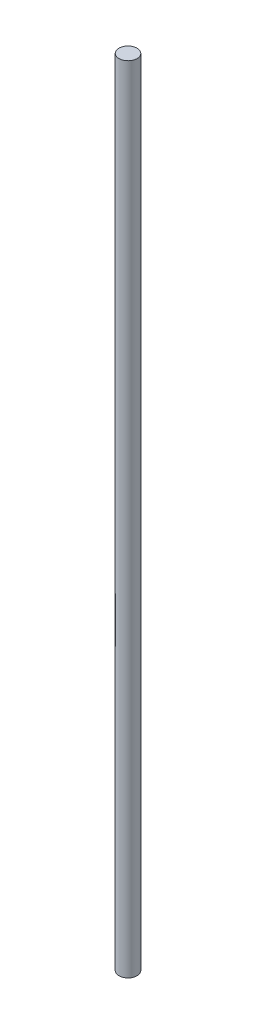
ISO-10303-21;
HEADER;
FILE_DESCRIPTION(('STEP AP214'),'2;1');
FILE_NAME('part.step','',(''),(''),'','','');
FILE_SCHEMA(('AUTOMOTIVE_DESIGN { 1 0 10303 214 1 1 1 1 }'));
ENDSEC;
DATA;
#1=APPLICATION_CONTEXT('core data for automotive mechanical design processes');
#2=APPLICATION_PROTOCOL_DEFINITION('international standard','automotive_design',2000,#1);
#3=PRODUCT_CONTEXT('',#1,'mechanical');
#4=PRODUCT('Part','Part','',(#3));
#5=PRODUCT_RELATED_PRODUCT_CATEGORY('part','',(#4));
#6=PRODUCT_DEFINITION_FORMATION('','',#4);
#7=PRODUCT_DEFINITION_CONTEXT('part definition',#1,'design');
#8=PRODUCT_DEFINITION('design','',#6,#7);
#9=PRODUCT_DEFINITION_SHAPE('','',#8);
#10=(LENGTH_UNIT() NAMED_UNIT(*) SI_UNIT(.MILLI.,.METRE.));
#11=(NAMED_UNIT(*) PLANE_ANGLE_UNIT() SI_UNIT($,.RADIAN.));
#12=(NAMED_UNIT(*) SI_UNIT($,.STERADIAN.) SOLID_ANGLE_UNIT());
#13=UNCERTAINTY_MEASURE_WITH_UNIT(LENGTH_MEASURE(1.E-05),#10,'distance_accuracy_value','');
#14=(GEOMETRIC_REPRESENTATION_CONTEXT(3) GLOBAL_UNCERTAINTY_ASSIGNED_CONTEXT((#13)) GLOBAL_UNIT_ASSIGNED_CONTEXT((#10,
#11,#12)) REPRESENTATION_CONTEXT('',''));
#15=CARTESIAN_POINT('',(0.,0.,0.));
#16=DIRECTION('',(0.,0.,1.));
#17=DIRECTION('',(1.,0.,0.));
#18=AXIS2_PLACEMENT_3D('',#15,#16,#17);
#19=CARTESIAN_POINT('',(0.,439.4,0.));
#20=DIRECTION('',(0.,1.,0.));
#21=DIRECTION('',(0.,0.,1.));
#22=AXIS2_PLACEMENT_3D('',#19,#20,#21);
#23=PLANE('',#22);
#24=CARTESIAN_POINT('',(0.,439.4,0.));
#25=DIRECTION('',(0.,-1.,0.));
#26=DIRECTION('',(0.,0.,-1.));
#27=AXIS2_PLACEMENT_3D('',#24,#25,#26);
#28=CIRCLE('',#27,5.);
#29=CARTESIAN_POINT('',(0.,439.4,-5.));
#30=VERTEX_POINT('',#29);
#31=EDGE_CURVE('E10',#30,#30,#28,.T.);
#32=ORIENTED_EDGE('',*,*,#31,.F.);
#33=EDGE_LOOP('',(#32));
#34=FACE_BOUND('',#33,.T.);
#35=ADVANCED_FACE('F31',(#34),#23,.T.);
#36=CARTESIAN_POINT('',(0.,0.,0.));
#37=DIRECTION('',(0.,-1.,0.));
#38=DIRECTION('',(0.,0.,-1.));
#39=AXIS2_PLACEMENT_3D('',#36,#37,#38);
#40=CYLINDRICAL_SURFACE('',#39,5.);
#41=ORIENTED_EDGE('',*,*,#31,.T.);
#42=EDGE_LOOP('',(#41));
#43=FACE_BOUND('',#42,.T.);
#44=CARTESIAN_POINT('',(0.,0.,0.));
#45=DIRECTION('',(0.,-1.,0.));
#46=DIRECTION('',(0.,0.,-1.));
#47=AXIS2_PLACEMENT_3D('',#44,#45,#46);
#48=CIRCLE('',#47,5.);
#49=CARTESIAN_POINT('',(0.,0.,-5.));
#50=VERTEX_POINT('',#49);
#51=EDGE_CURVE('E37',#50,#50,#48,.T.);
#52=ORIENTED_EDGE('',*,*,#51,.F.);
#53=EDGE_LOOP('',(#52));
#54=FACE_BOUND('',#53,.T.);
#55=ADVANCED_FACE('F45',(#43,#54),#40,.T.);
#56=CARTESIAN_POINT('',(0.,0.,0.));
#57=DIRECTION('',(0.,-1.,0.));
#58=DIRECTION('',(0.,0.,-1.));
#59=AXIS2_PLACEMENT_3D('',#56,#57,#58);
#60=PLANE('',#59);
#61=ORIENTED_EDGE('',*,*,#51,.T.);
#62=EDGE_LOOP('',(#61));
#63=FACE_BOUND('',#62,.T.);
#64=ADVANCED_FACE('F43',(#63),#60,.T.);
#65=CLOSED_SHELL('',(#35,#55,#64));
#66=MANIFOLD_SOLID_BREP('B2',#65);
#67=ADVANCED_BREP_SHAPE_REPRESENTATION('',(#18,#66),#14);
#68=SHAPE_DEFINITION_REPRESENTATION(#9,#67);
ENDSEC;
END-ISO-10303-21;
